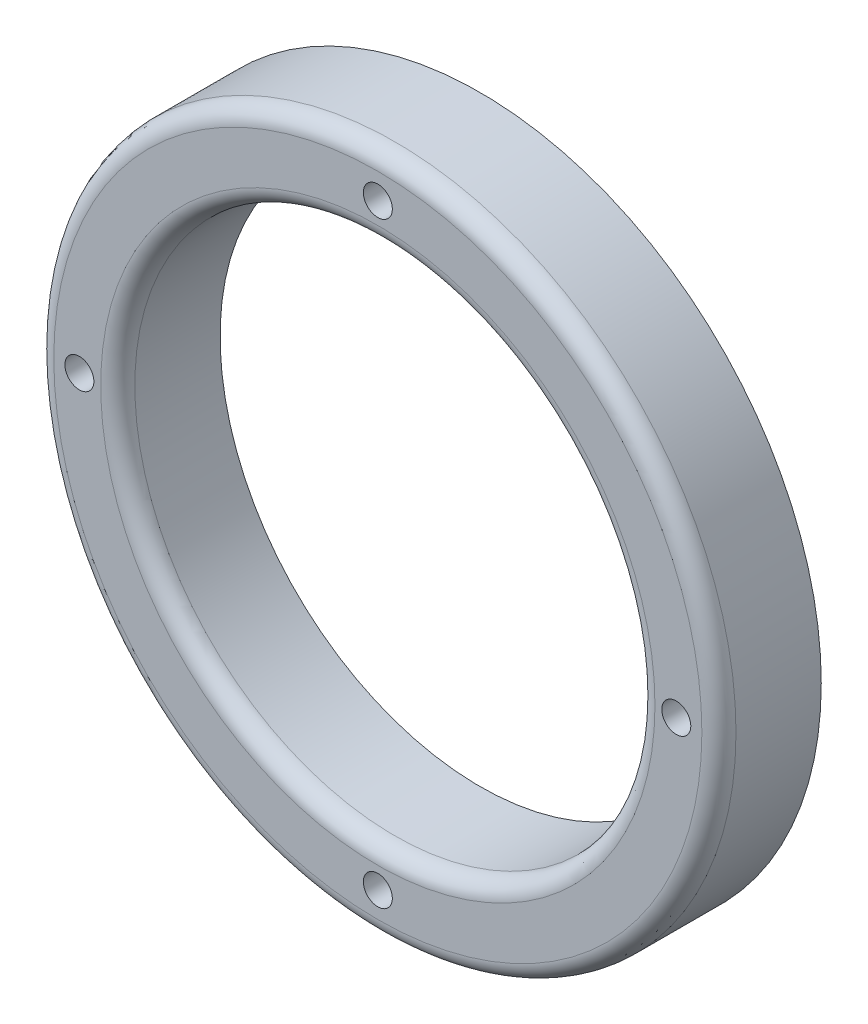
ISO-10303-21;
HEADER;
FILE_DESCRIPTION(('STEP AP214'),'2;1');
FILE_NAME('part.step','',(''),(''),'','','');
FILE_SCHEMA(('AUTOMOTIVE_DESIGN { 1 0 10303 214 1 1 1 1 }'));
ENDSEC;
DATA;
#1=APPLICATION_CONTEXT('core data for automotive mechanical design processes');
#2=APPLICATION_PROTOCOL_DEFINITION('international standard','automotive_design',2000,#1);
#3=PRODUCT_CONTEXT('',#1,'mechanical');
#4=PRODUCT('Part','Part','',(#3));
#5=PRODUCT_RELATED_PRODUCT_CATEGORY('part','',(#4));
#6=PRODUCT_DEFINITION_FORMATION('','',#4);
#7=PRODUCT_DEFINITION_CONTEXT('part definition',#1,'design');
#8=PRODUCT_DEFINITION('design','',#6,#7);
#9=PRODUCT_DEFINITION_SHAPE('','',#8);
#10=(LENGTH_UNIT() NAMED_UNIT(*) SI_UNIT(.MILLI.,.METRE.));
#11=(NAMED_UNIT(*) PLANE_ANGLE_UNIT() SI_UNIT($,.RADIAN.));
#12=(NAMED_UNIT(*) SI_UNIT($,.STERADIAN.) SOLID_ANGLE_UNIT());
#13=UNCERTAINTY_MEASURE_WITH_UNIT(LENGTH_MEASURE(1.E-05),#10,'distance_accuracy_value','');
#14=(GEOMETRIC_REPRESENTATION_CONTEXT(3) GLOBAL_UNCERTAINTY_ASSIGNED_CONTEXT((#13)) GLOBAL_UNIT_ASSIGNED_CONTEXT((#10,
#11,#12)) REPRESENTATION_CONTEXT('',''));
#15=CARTESIAN_POINT('',(0.,0.,0.));
#16=DIRECTION('',(0.,0.,1.));
#17=DIRECTION('',(1.,0.,0.));
#18=AXIS2_PLACEMENT_3D('',#15,#16,#17);
#19=CARTESIAN_POINT('',(0.,0.,12.));
#20=DIRECTION('',(0.,0.,1.));
#21=DIRECTION('',(1.,0.,0.));
#22=AXIS2_PLACEMENT_3D('',#19,#20,#21);
#23=PLANE('',#22);
#24=CARTESIAN_POINT('',(0.,0.,12.));
#25=DIRECTION('',(0.,0.,1.));
#26=DIRECTION('',(1.,0.,0.));
#27=AXIS2_PLACEMENT_3D('',#24,#25,#26);
#28=CIRCLE('',#27,38.);
#29=CARTESIAN_POINT('',(38.,0.,12.));
#30=VERTEX_POINT('',#29);
#31=EDGE_CURVE('E44',#30,#30,#28,.T.);
#32=ORIENTED_EDGE('',*,*,#31,.T.);
#33=EDGE_LOOP('',(#32));
#34=FACE_BOUND('',#33,.T.);
#35=CARTESIAN_POINT('',(0.,0.,12.));
#36=DIRECTION('',(0.,0.,1.));
#37=DIRECTION('',(1.,0.,0.));
#38=AXIS2_PLACEMENT_3D('',#35,#36,#37);
#39=CIRCLE('',#38,32.5);
#40=CARTESIAN_POINT('',(32.5,0.,12.));
#41=VERTEX_POINT('',#40);
#42=EDGE_CURVE('E48',#41,#41,#39,.F.);
#43=ORIENTED_EDGE('',*,*,#42,.T.);
#44=EDGE_LOOP('',(#43));
#45=FACE_BOUND('',#44,.T.);
#46=CARTESIAN_POINT('',(35.,0.,12.));
#47=DIRECTION('',(0.,0.,1.));
#48=DIRECTION('',(1.,0.,0.));
#49=AXIS2_PLACEMENT_3D('',#46,#47,#48);
#50=CIRCLE('',#49,1.7);
#51=CARTESIAN_POINT('',(36.7,0.,12.));
#52=VERTEX_POINT('',#51);
#53=EDGE_CURVE('E82',#52,#52,#50,.T.);
#54=ORIENTED_EDGE('',*,*,#53,.F.);
#55=EDGE_LOOP('',(#54));
#56=FACE_BOUND('',#55,.T.);
#57=CARTESIAN_POINT('',(0.,-35.,12.));
#58=DIRECTION('',(0.,0.,1.));
#59=DIRECTION('',(1.,0.,0.));
#60=AXIS2_PLACEMENT_3D('',#57,#58,#59);
#61=CIRCLE('',#60,1.7);
#62=CARTESIAN_POINT('',(1.70000000000001,-35.,12.));
#63=VERTEX_POINT('',#62);
#64=EDGE_CURVE('E79',#63,#63,#61,.T.);
#65=ORIENTED_EDGE('',*,*,#64,.F.);
#66=EDGE_LOOP('',(#65));
#67=FACE_BOUND('',#66,.T.);
#68=CARTESIAN_POINT('',(-35.,0.,12.));
#69=DIRECTION('',(0.,0.,1.));
#70=DIRECTION('',(1.,0.,0.));
#71=AXIS2_PLACEMENT_3D('',#68,#69,#70);
#72=CIRCLE('',#71,1.7);
#73=CARTESIAN_POINT('',(-33.3,0.,12.));
#74=VERTEX_POINT('',#73);
#75=EDGE_CURVE('E73',#74,#74,#72,.T.);
#76=ORIENTED_EDGE('',*,*,#75,.F.);
#77=EDGE_LOOP('',(#76));
#78=FACE_BOUND('',#77,.T.);
#79=CARTESIAN_POINT('',(0.,35.,12.));
#80=DIRECTION('',(0.,0.,1.));
#81=DIRECTION('',(1.,0.,0.));
#82=AXIS2_PLACEMENT_3D('',#79,#80,#81);
#83=CIRCLE('',#82,1.7);
#84=CARTESIAN_POINT('',(1.7,35.,12.));
#85=VERTEX_POINT('',#84);
#86=EDGE_CURVE('E67',#85,#85,#83,.T.);
#87=ORIENTED_EDGE('',*,*,#86,.F.);
#88=EDGE_LOOP('',(#87));
#89=FACE_BOUND('',#88,.T.);
#90=ADVANCED_FACE('F37',(#34,#45,#56,#67,#78,#89),#23,.T.);
#91=CARTESIAN_POINT('',(0.,0.,0.));
#92=DIRECTION('',(0.,0.,1.));
#93=DIRECTION('',(1.,0.,0.));
#94=AXIS2_PLACEMENT_3D('',#91,#92,#93);
#95=PLANE('',#94);
#96=CARTESIAN_POINT('',(35.,0.,0.));
#97=DIRECTION('',(0.,0.,1.));
#98=DIRECTION('',(1.,0.,0.));
#99=AXIS2_PLACEMENT_3D('',#96,#97,#98);
#100=CIRCLE('',#99,1.7);
#101=CARTESIAN_POINT('',(36.7,0.,0.));
#102=VERTEX_POINT('',#101);
#103=EDGE_CURVE('E63',#102,#102,#100,.T.);
#104=ORIENTED_EDGE('',*,*,#103,.T.);
#105=EDGE_LOOP('',(#104));
#106=FACE_BOUND('',#105,.T.);
#107=CARTESIAN_POINT('',(0.,-35.,0.));
#108=DIRECTION('',(0.,0.,1.));
#109=DIRECTION('',(1.,0.,0.));
#110=AXIS2_PLACEMENT_3D('',#107,#108,#109);
#111=CIRCLE('',#110,1.7);
#112=CARTESIAN_POINT('',(1.70000000000001,-35.,0.));
#113=VERTEX_POINT('',#112);
#114=EDGE_CURVE('E76',#113,#113,#111,.T.);
#115=ORIENTED_EDGE('',*,*,#114,.T.);
#116=EDGE_LOOP('',(#115));
#117=FACE_BOUND('',#116,.T.);
#118=CARTESIAN_POINT('',(-35.,0.,0.));
#119=DIRECTION('',(0.,0.,1.));
#120=DIRECTION('',(1.,0.,0.));
#121=AXIS2_PLACEMENT_3D('',#118,#119,#120);
#122=CIRCLE('',#121,1.7);
#123=CARTESIAN_POINT('',(-33.3,0.,0.));
#124=VERTEX_POINT('',#123);
#125=EDGE_CURVE('E70',#124,#124,#122,.T.);
#126=ORIENTED_EDGE('',*,*,#125,.T.);
#127=EDGE_LOOP('',(#126));
#128=FACE_BOUND('',#127,.T.);
#129=CARTESIAN_POINT('',(0.,35.,0.));
#130=DIRECTION('',(0.,0.,1.));
#131=DIRECTION('',(1.,0.,0.));
#132=AXIS2_PLACEMENT_3D('',#129,#130,#131);
#133=CIRCLE('',#132,1.7);
#134=CARTESIAN_POINT('',(1.7,35.,0.));
#135=VERTEX_POINT('',#134);
#136=EDGE_CURVE('E64',#135,#135,#133,.T.);
#137=ORIENTED_EDGE('',*,*,#136,.T.);
#138=EDGE_LOOP('',(#137));
#139=FACE_BOUND('',#138,.T.);
#140=CARTESIAN_POINT('',(0.,0.,0.));
#141=DIRECTION('',(0.,0.,1.));
#142=DIRECTION('',(1.,0.,0.));
#143=AXIS2_PLACEMENT_3D('',#140,#141,#142);
#144=CIRCLE('',#143,40.);
#145=CARTESIAN_POINT('',(40.,0.,0.));
#146=VERTEX_POINT('',#145);
#147=EDGE_CURVE('E57',#146,#146,#144,.T.);
#148=ORIENTED_EDGE('',*,*,#147,.F.);
#149=EDGE_LOOP('',(#148));
#150=FACE_BOUND('',#149,.T.);
#151=CARTESIAN_POINT('',(0.,0.,0.));
#152=DIRECTION('',(0.,0.,1.));
#153=DIRECTION('',(1.,0.,0.));
#154=AXIS2_PLACEMENT_3D('',#151,#152,#153);
#155=CIRCLE('',#154,30.5);
#156=CARTESIAN_POINT('',(30.5,0.,0.));
#157=VERTEX_POINT('',#156);
#158=EDGE_CURVE('E60',#157,#157,#155,.T.);
#159=ORIENTED_EDGE('',*,*,#158,.T.);
#160=EDGE_LOOP('',(#159));
#161=FACE_BOUND('',#160,.T.);
#162=ADVANCED_FACE('F88',(#106,#117,#128,#139,#150,#161),#95,.F.);
#163=CARTESIAN_POINT('',(0.,0.,12.));
#164=DIRECTION('',(0.,0.,-1.));
#165=DIRECTION('',(-1.,0.,0.));
#166=AXIS2_PLACEMENT_3D('',#163,#164,#165);
#167=CYLINDRICAL_SURFACE('',#166,40.);
#168=CARTESIAN_POINT('',(0.,0.,10.));
#169=DIRECTION('',(0.,0.,1.));
#170=DIRECTION('',(1.,0.,0.));
#171=AXIS2_PLACEMENT_3D('',#168,#169,#170);
#172=CIRCLE('',#171,40.);
#173=CARTESIAN_POINT('',(40.,0.,10.));
#174=VERTEX_POINT('',#173);
#175=EDGE_CURVE('E10',#174,#174,#172,.F.);
#176=ORIENTED_EDGE('',*,*,#175,.T.);
#177=EDGE_LOOP('',(#176));
#178=FACE_BOUND('',#177,.T.);
#179=ORIENTED_EDGE('',*,*,#147,.T.);
#180=EDGE_LOOP('',(#179));
#181=FACE_BOUND('',#180,.T.);
#182=ADVANCED_FACE('F121',(#178,#181),#167,.T.);
#183=CARTESIAN_POINT('',(0.,0.,12.));
#184=DIRECTION('',(0.,0.,-1.));
#185=DIRECTION('',(-1.,0.,0.));
#186=AXIS2_PLACEMENT_3D('',#183,#184,#185);
#187=CYLINDRICAL_SURFACE('',#186,30.5);
#188=CARTESIAN_POINT('',(0.,0.,10.));
#189=DIRECTION('',(0.,0.,1.));
#190=DIRECTION('',(1.,0.,0.));
#191=AXIS2_PLACEMENT_3D('',#188,#189,#190);
#192=CIRCLE('',#191,30.5);
#193=CARTESIAN_POINT('',(30.5,0.,10.));
#194=VERTEX_POINT('',#193);
#195=EDGE_CURVE('E52',#194,#194,#192,.T.);
#196=ORIENTED_EDGE('',*,*,#195,.T.);
#197=EDGE_LOOP('',(#196));
#198=FACE_BOUND('',#197,.T.);
#199=ORIENTED_EDGE('',*,*,#158,.F.);
#200=EDGE_LOOP('',(#199));
#201=FACE_BOUND('',#200,.T.);
#202=ADVANCED_FACE('F111',(#198,#201),#187,.F.);
#203=CARTESIAN_POINT('',(0.,35.,0.));
#204=DIRECTION('',(0.,0.,1.));
#205=DIRECTION('',(1.,0.,0.));
#206=AXIS2_PLACEMENT_3D('',#203,#204,#205);
#207=CYLINDRICAL_SURFACE('',#206,1.7);
#208=ORIENTED_EDGE('',*,*,#136,.F.);
#209=EDGE_LOOP('',(#208));
#210=FACE_BOUND('',#209,.T.);
#211=ORIENTED_EDGE('',*,*,#86,.T.);
#212=EDGE_LOOP('',(#211));
#213=FACE_BOUND('',#212,.T.);
#214=ADVANCED_FACE('F108',(#210,#213),#207,.F.);
#215=CARTESIAN_POINT('',(-35.,0.,0.));
#216=DIRECTION('',(0.,0.,1.));
#217=DIRECTION('',(1.,0.,0.));
#218=AXIS2_PLACEMENT_3D('',#215,#216,#217);
#219=CYLINDRICAL_SURFACE('',#218,1.7);
#220=ORIENTED_EDGE('',*,*,#125,.F.);
#221=EDGE_LOOP('',(#220));
#222=FACE_BOUND('',#221,.T.);
#223=ORIENTED_EDGE('',*,*,#75,.T.);
#224=EDGE_LOOP('',(#223));
#225=FACE_BOUND('',#224,.T.);
#226=ADVANCED_FACE('F110',(#222,#225),#219,.F.);
#227=CARTESIAN_POINT('',(0.,-35.,0.));
#228=DIRECTION('',(0.,0.,1.));
#229=DIRECTION('',(1.,0.,0.));
#230=AXIS2_PLACEMENT_3D('',#227,#228,#229);
#231=CYLINDRICAL_SURFACE('',#230,1.7);
#232=ORIENTED_EDGE('',*,*,#114,.F.);
#233=EDGE_LOOP('',(#232));
#234=FACE_BOUND('',#233,.T.);
#235=ORIENTED_EDGE('',*,*,#64,.T.);
#236=EDGE_LOOP('',(#235));
#237=FACE_BOUND('',#236,.T.);
#238=ADVANCED_FACE('F95',(#234,#237),#231,.F.);
#239=CARTESIAN_POINT('',(35.,0.,0.));
#240=DIRECTION('',(0.,0.,1.));
#241=DIRECTION('',(1.,0.,0.));
#242=AXIS2_PLACEMENT_3D('',#239,#240,#241);
#243=CYLINDRICAL_SURFACE('',#242,1.7);
#244=ORIENTED_EDGE('',*,*,#103,.F.);
#245=EDGE_LOOP('',(#244));
#246=FACE_BOUND('',#245,.T.);
#247=ORIENTED_EDGE('',*,*,#53,.T.);
#248=EDGE_LOOP('',(#247));
#249=FACE_BOUND('',#248,.T.);
#250=ADVANCED_FACE('F91',(#246,#249),#243,.F.);
#251=CARTESIAN_POINT('',(0.,0.,10.));
#252=DIRECTION('',(0.,0.,1.));
#253=DIRECTION('',(1.,0.,0.));
#254=AXIS2_PLACEMENT_3D('',#251,#252,#253);
#255=TOROIDAL_SURFACE('',#254,32.5,2.);
#256=ORIENTED_EDGE('',*,*,#42,.F.);
#257=EDGE_LOOP('',(#256));
#258=FACE_BOUND('',#257,.T.);
#259=ORIENTED_EDGE('',*,*,#195,.F.);
#260=EDGE_LOOP('',(#259));
#261=FACE_BOUND('',#260,.T.);
#262=ADVANCED_FACE('F94',(#258,#261),#255,.T.);
#263=CARTESIAN_POINT('',(0.,0.,10.));
#264=DIRECTION('',(0.,0.,1.));
#265=DIRECTION('',(1.,0.,0.));
#266=AXIS2_PLACEMENT_3D('',#263,#264,#265);
#267=TOROIDAL_SURFACE('',#266,38.,2.);
#268=ORIENTED_EDGE('',*,*,#175,.F.);
#269=EDGE_LOOP('',(#268));
#270=FACE_BOUND('',#269,.T.);
#271=ORIENTED_EDGE('',*,*,#31,.F.);
#272=EDGE_LOOP('',(#271));
#273=FACE_BOUND('',#272,.T.);
#274=ADVANCED_FACE('F39',(#270,#273),#267,.T.);
#275=CLOSED_SHELL('',(#90,#162,#182,#202,#214,#226,#238,#250,#262,#274));
#276=MANIFOLD_SOLID_BREP('B2',#275);
#277=ADVANCED_BREP_SHAPE_REPRESENTATION('',(#18,#276),#14);
#278=SHAPE_DEFINITION_REPRESENTATION(#9,#277);
ENDSEC;
END-ISO-10303-21;
